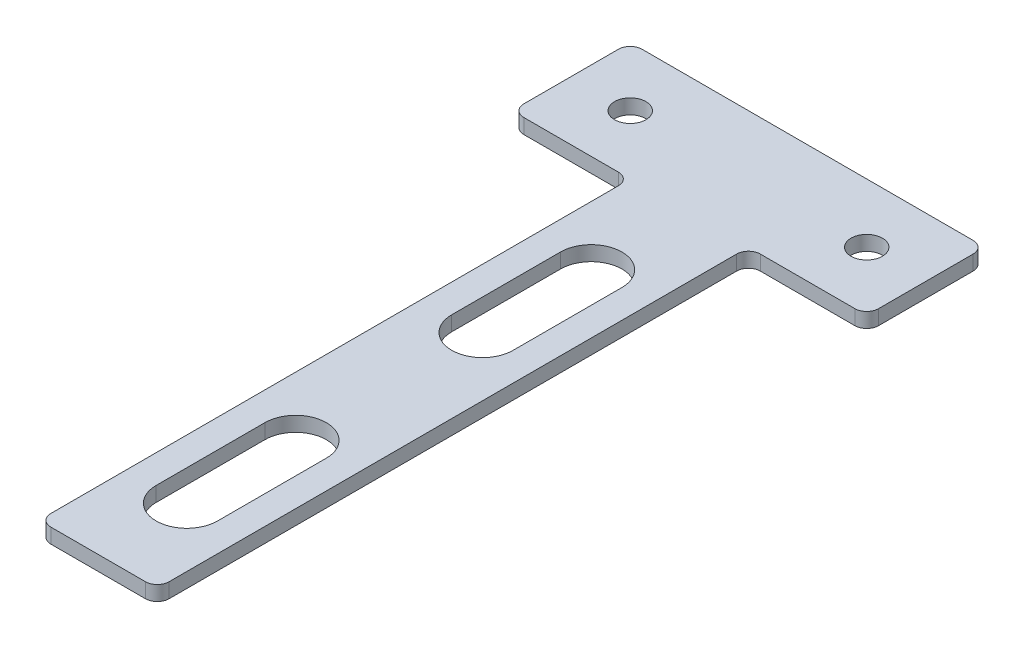
ISO-10303-21;
HEADER;
FILE_DESCRIPTION(('STEP AP214'),'2;1');
FILE_NAME('part.step','',(''),(''),'','','');
FILE_SCHEMA(('AUTOMOTIVE_DESIGN { 1 0 10303 214 1 1 1 1 }'));
ENDSEC;
DATA;
#1=APPLICATION_CONTEXT('core data for automotive mechanical design processes');
#2=APPLICATION_PROTOCOL_DEFINITION('international standard','automotive_design',2000,#1);
#3=PRODUCT_CONTEXT('',#1,'mechanical');
#4=PRODUCT('Part','Part','',(#3));
#5=PRODUCT_RELATED_PRODUCT_CATEGORY('part','',(#4));
#6=PRODUCT_DEFINITION_FORMATION('','',#4);
#7=PRODUCT_DEFINITION_CONTEXT('part definition',#1,'design');
#8=PRODUCT_DEFINITION('design','',#6,#7);
#9=PRODUCT_DEFINITION_SHAPE('','',#8);
#10=(LENGTH_UNIT() NAMED_UNIT(*) SI_UNIT(.MILLI.,.METRE.));
#11=(NAMED_UNIT(*) PLANE_ANGLE_UNIT() SI_UNIT($,.RADIAN.));
#12=(NAMED_UNIT(*) SI_UNIT($,.STERADIAN.) SOLID_ANGLE_UNIT());
#13=UNCERTAINTY_MEASURE_WITH_UNIT(LENGTH_MEASURE(1.E-05),#10,'distance_accuracy_value','');
#14=(GEOMETRIC_REPRESENTATION_CONTEXT(3) GLOBAL_UNCERTAINTY_ASSIGNED_CONTEXT((#13)) GLOBAL_UNIT_ASSIGNED_CONTEXT((#10,
#11,#12)) REPRESENTATION_CONTEXT('',''));
#15=CARTESIAN_POINT('',(0.,0.,0.));
#16=DIRECTION('',(0.,0.,1.));
#17=DIRECTION('',(1.,0.,0.));
#18=AXIS2_PLACEMENT_3D('',#15,#16,#17);
#19=CARTESIAN_POINT('',(0.,3.175,-76.2));
#20=DIRECTION('',(0.,0.,1.));
#21=DIRECTION('',(1.,0.,0.));
#22=AXIS2_PLACEMENT_3D('',#19,#20,#21);
#23=PLANE('',#22);
#24=DIRECTION('',(-1.,0.,0.));
#25=VECTOR('',#24,1.);
#26=CARTESIAN_POINT('',(0.,3.175,-76.2));
#27=LINE('',#26,#25);
#28=CARTESIAN_POINT('',(35.56,3.175,-76.2));
#29=VERTEX_POINT('',#28);
#30=CARTESIAN_POINT('',(-35.56,3.175,-76.2));
#31=VERTEX_POINT('',#30);
#32=EDGE_CURVE('E282',#29,#31,#27,.T.);
#33=ORIENTED_EDGE('',*,*,#32,.F.);
#34=DIRECTION('',(0.,-1.,0.));
#35=VECTOR('',#34,1.);
#36=CARTESIAN_POINT('',(35.56,0.,-76.2));
#37=LINE('',#36,#35);
#38=CARTESIAN_POINT('',(35.56,0.,-76.2));
#39=VERTEX_POINT('',#38);
#40=EDGE_CURVE('E386',#29,#39,#37,.T.);
#41=ORIENTED_EDGE('',*,*,#40,.T.);
#42=DIRECTION('',(-1.,0.,0.));
#43=VECTOR('',#42,1.);
#44=CARTESIAN_POINT('',(0.,0.,-76.2));
#45=LINE('',#44,#43);
#46=CARTESIAN_POINT('',(-35.56,0.,-76.2));
#47=VERTEX_POINT('',#46);
#48=EDGE_CURVE('E277',#39,#47,#45,.T.);
#49=ORIENTED_EDGE('',*,*,#48,.T.);
#50=DIRECTION('',(0.,-1.,0.));
#51=VECTOR('',#50,1.);
#52=CARTESIAN_POINT('',(-35.56,3.175,-76.2));
#53=LINE('',#52,#51);
#54=EDGE_CURVE('E384',#47,#31,#53,.F.);
#55=ORIENTED_EDGE('',*,*,#54,.T.);
#56=EDGE_LOOP('',(#33,#41,#49,#55));
#57=FACE_BOUND('',#56,.T.);
#58=ADVANCED_FACE('F34',(#57),#23,.F.);
#59=CARTESIAN_POINT('',(-38.1,3.175,0.));
#60=DIRECTION('',(1.,0.,0.));
#61=DIRECTION('',(0.,0.,-1.));
#62=AXIS2_PLACEMENT_3D('',#59,#60,#61);
#63=PLANE('',#62);
#64=DIRECTION('',(0.,0.,1.));
#65=VECTOR('',#64,1.);
#66=CARTESIAN_POINT('',(-38.1,0.,0.));
#67=LINE('',#66,#65);
#68=CARTESIAN_POINT('',(-38.1,0.,-73.66));
#69=VERTEX_POINT('',#68);
#70=CARTESIAN_POINT('',(-38.1,0.,-53.34));
#71=VERTEX_POINT('',#70);
#72=EDGE_CURVE('E308',#69,#71,#67,.T.);
#73=ORIENTED_EDGE('',*,*,#72,.T.);
#74=DIRECTION('',(0.,-1.,0.));
#75=VECTOR('',#74,1.);
#76=CARTESIAN_POINT('',(-38.1,3.175,-53.34));
#77=LINE('',#76,#75);
#78=CARTESIAN_POINT('',(-38.1,3.175,-53.34));
#79=VERTEX_POINT('',#78);
#80=EDGE_CURVE('E378',#71,#79,#77,.F.);
#81=ORIENTED_EDGE('',*,*,#80,.T.);
#82=DIRECTION('',(0.,0.,1.));
#83=VECTOR('',#82,1.);
#84=CARTESIAN_POINT('',(-38.1,3.175,0.));
#85=LINE('',#84,#83);
#86=CARTESIAN_POINT('',(-38.1,3.175,-73.66));
#87=VERTEX_POINT('',#86);
#88=EDGE_CURVE('E285',#87,#79,#85,.T.);
#89=ORIENTED_EDGE('',*,*,#88,.F.);
#90=DIRECTION('',(0.,-1.,0.));
#91=VECTOR('',#90,1.);
#92=CARTESIAN_POINT('',(-38.1,3.175,-73.66));
#93=LINE('',#92,#91);
#94=EDGE_CURVE('E375',#87,#69,#93,.T.);
#95=ORIENTED_EDGE('',*,*,#94,.T.);
#96=EDGE_LOOP('',(#73,#81,#89,#95));
#97=FACE_BOUND('',#96,.T.);
#98=ADVANCED_FACE('F454',(#97),#63,.F.);
#99=CARTESIAN_POINT('',(0.,3.175,-50.8));
#100=DIRECTION('',(0.,0.,1.));
#101=DIRECTION('',(1.,0.,0.));
#102=AXIS2_PLACEMENT_3D('',#99,#100,#101);
#103=PLANE('',#102);
#104=DIRECTION('',(-1.,0.,0.));
#105=VECTOR('',#104,1.);
#106=CARTESIAN_POINT('',(0.,0.,-50.8));
#107=LINE('',#106,#105);
#108=CARTESIAN_POINT('',(-15.24,0.,-50.8));
#109=VERTEX_POINT('',#108);
#110=CARTESIAN_POINT('',(-35.56,0.,-50.8));
#111=VERTEX_POINT('',#110);
#112=EDGE_CURVE('E311',#109,#111,#107,.T.);
#113=ORIENTED_EDGE('',*,*,#112,.F.);
#114=DIRECTION('',(0.,-1.,0.));
#115=VECTOR('',#114,1.);
#116=CARTESIAN_POINT('',(-15.24,3.175,-50.8));
#117=LINE('',#116,#115);
#118=CARTESIAN_POINT('',(-15.24,3.175,-50.8));
#119=VERTEX_POINT('',#118);
#120=EDGE_CURVE('E373',#109,#119,#117,.F.);
#121=ORIENTED_EDGE('',*,*,#120,.T.);
#122=DIRECTION('',(-1.,0.,0.));
#123=VECTOR('',#122,1.);
#124=CARTESIAN_POINT('',(0.,3.175,-50.8));
#125=LINE('',#124,#123);
#126=CARTESIAN_POINT('',(-35.56,3.175,-50.8));
#127=VERTEX_POINT('',#126);
#128=EDGE_CURVE('E289',#119,#127,#125,.T.);
#129=ORIENTED_EDGE('',*,*,#128,.T.);
#130=DIRECTION('',(0.,-1.,0.));
#131=VECTOR('',#130,1.);
#132=CARTESIAN_POINT('',(-35.56,0.,-50.8));
#133=LINE('',#132,#131);
#134=EDGE_CURVE('E370',#127,#111,#133,.T.);
#135=ORIENTED_EDGE('',*,*,#134,.T.);
#136=EDGE_LOOP('',(#113,#121,#129,#135));
#137=FACE_BOUND('',#136,.T.);
#138=ADVANCED_FACE('F400',(#137),#103,.T.);
#139=CARTESIAN_POINT('',(-12.7,3.175,0.));
#140=DIRECTION('',(1.,0.,0.));
#141=DIRECTION('',(0.,0.,-1.));
#142=AXIS2_PLACEMENT_3D('',#139,#140,#141);
#143=PLANE('',#142);
#144=DIRECTION('',(0.,0.,1.));
#145=VECTOR('',#144,1.);
#146=CARTESIAN_POINT('',(-12.7,0.,0.));
#147=LINE('',#146,#145);
#148=CARTESIAN_POINT('',(-12.7,0.,-48.26));
#149=VERTEX_POINT('',#148);
#150=CARTESIAN_POINT('',(-12.7000000000001,0.,73.66));
#151=VERTEX_POINT('',#150);
#152=EDGE_CURVE('E314',#149,#151,#147,.T.);
#153=ORIENTED_EDGE('',*,*,#152,.T.);
#154=DIRECTION('',(0.,-1.,0.));
#155=VECTOR('',#154,1.);
#156=CARTESIAN_POINT('',(-12.7000000000001,3.175,73.66));
#157=LINE('',#156,#155);
#158=CARTESIAN_POINT('',(-12.7000000000001,3.175,73.66));
#159=VERTEX_POINT('',#158);
#160=EDGE_CURVE('E347',#151,#159,#157,.F.);
#161=ORIENTED_EDGE('',*,*,#160,.T.);
#162=DIRECTION('',(0.,0.,1.));
#163=VECTOR('',#162,1.);
#164=CARTESIAN_POINT('',(-12.7,3.175,0.));
#165=LINE('',#164,#163);
#166=CARTESIAN_POINT('',(-12.7,3.175,-48.26));
#167=VERTEX_POINT('',#166);
#168=EDGE_CURVE('E292',#167,#159,#165,.T.);
#169=ORIENTED_EDGE('',*,*,#168,.F.);
#170=DIRECTION('',(0.,-1.,0.));
#171=VECTOR('',#170,1.);
#172=CARTESIAN_POINT('',(-12.7,3.175,-48.26));
#173=LINE('',#172,#171);
#174=EDGE_CURVE('E344',#167,#149,#173,.T.);
#175=ORIENTED_EDGE('',*,*,#174,.T.);
#176=EDGE_LOOP('',(#153,#161,#169,#175));
#177=FACE_BOUND('',#176,.T.);
#178=ADVANCED_FACE('F409',(#177),#143,.F.);
#179=CARTESIAN_POINT('',(0.,3.175,76.2));
#180=DIRECTION('',(0.,0.,-1.));
#181=DIRECTION('',(-1.,0.,0.));
#182=AXIS2_PLACEMENT_3D('',#179,#180,#181);
#183=PLANE('',#182);
#184=DIRECTION('',(1.,0.,0.));
#185=VECTOR('',#184,1.);
#186=CARTESIAN_POINT('',(0.,3.175,76.2));
#187=LINE('',#186,#185);
#188=CARTESIAN_POINT('',(-10.1600000000001,3.175,76.2));
#189=VERTEX_POINT('',#188);
#190=CARTESIAN_POINT('',(10.16,3.175,76.2));
#191=VERTEX_POINT('',#190);
#192=EDGE_CURVE('E295',#189,#191,#187,.T.);
#193=ORIENTED_EDGE('',*,*,#192,.F.);
#194=DIRECTION('',(0.,-1.,0.));
#195=VECTOR('',#194,1.);
#196=CARTESIAN_POINT('',(-10.1600000000001,3.175,76.2));
#197=LINE('',#196,#195);
#198=CARTESIAN_POINT('',(-10.1600000000001,0.,76.2));
#199=VERTEX_POINT('',#198);
#200=EDGE_CURVE('E329',#189,#199,#197,.T.);
#201=ORIENTED_EDGE('',*,*,#200,.T.);
#202=DIRECTION('',(1.,0.,0.));
#203=VECTOR('',#202,1.);
#204=CARTESIAN_POINT('',(0.,0.,76.2));
#205=LINE('',#204,#203);
#206=CARTESIAN_POINT('',(10.16,0.,76.2));
#207=VERTEX_POINT('',#206);
#208=EDGE_CURVE('E317',#199,#207,#205,.T.);
#209=ORIENTED_EDGE('',*,*,#208,.T.);
#210=DIRECTION('',(0.,-1.,0.));
#211=VECTOR('',#210,1.);
#212=CARTESIAN_POINT('',(10.16,3.175,76.2));
#213=LINE('',#212,#211);
#214=EDGE_CURVE('E305',#207,#191,#213,.F.);
#215=ORIENTED_EDGE('',*,*,#214,.T.);
#216=EDGE_LOOP('',(#193,#201,#209,#215));
#217=FACE_BOUND('',#216,.T.);
#218=ADVANCED_FACE('F417',(#217),#183,.F.);
#219=CARTESIAN_POINT('',(12.7,3.175,0.));
#220=DIRECTION('',(-1.,0.,0.));
#221=DIRECTION('',(0.,0.,1.));
#222=AXIS2_PLACEMENT_3D('',#219,#220,#221);
#223=PLANE('',#222);
#224=DIRECTION('',(0.,0.,-1.));
#225=VECTOR('',#224,1.);
#226=CARTESIAN_POINT('',(12.7,3.175,0.));
#227=LINE('',#226,#225);
#228=CARTESIAN_POINT('',(12.7,3.175,73.66));
#229=VERTEX_POINT('',#228);
#230=CARTESIAN_POINT('',(12.7,3.175,-48.26));
#231=VERTEX_POINT('',#230);
#232=EDGE_CURVE('E298',#229,#231,#227,.T.);
#233=ORIENTED_EDGE('',*,*,#232,.F.);
#234=DIRECTION('',(0.,-1.,0.));
#235=VECTOR('',#234,1.);
#236=CARTESIAN_POINT('',(12.7,3.175,73.66));
#237=LINE('',#236,#235);
#238=CARTESIAN_POINT('',(12.7,0.,73.66));
#239=VERTEX_POINT('',#238);
#240=EDGE_CURVE('E362',#229,#239,#237,.T.);
#241=ORIENTED_EDGE('',*,*,#240,.T.);
#242=DIRECTION('',(0.,0.,-1.));
#243=VECTOR('',#242,1.);
#244=CARTESIAN_POINT('',(12.7,0.,0.));
#245=LINE('',#244,#243);
#246=CARTESIAN_POINT('',(12.7,0.,-48.26));
#247=VERTEX_POINT('',#246);
#248=EDGE_CURVE('E320',#239,#247,#245,.T.);
#249=ORIENTED_EDGE('',*,*,#248,.T.);
#250=DIRECTION('',(0.,-1.,0.));
#251=VECTOR('',#250,1.);
#252=CARTESIAN_POINT('',(12.7,3.175,-48.26));
#253=LINE('',#252,#251);
#254=EDGE_CURVE('E360',#247,#231,#253,.F.);
#255=ORIENTED_EDGE('',*,*,#254,.T.);
#256=EDGE_LOOP('',(#233,#241,#249,#255));
#257=FACE_BOUND('',#256,.T.);
#258=ADVANCED_FACE('F425',(#257),#223,.F.);
#259=CARTESIAN_POINT('',(0.,3.175,-50.8));
#260=DIRECTION('',(0.,0.,-1.));
#261=DIRECTION('',(-1.,0.,0.));
#262=AXIS2_PLACEMENT_3D('',#259,#260,#261);
#263=PLANE('',#262);
#264=DIRECTION('',(1.,0.,0.));
#265=VECTOR('',#264,1.);
#266=CARTESIAN_POINT('',(0.,3.175,-50.8));
#267=LINE('',#266,#265);
#268=CARTESIAN_POINT('',(15.24,3.175,-50.8));
#269=VERTEX_POINT('',#268);
#270=CARTESIAN_POINT('',(35.56,3.175,-50.8));
#271=VERTEX_POINT('',#270);
#272=EDGE_CURVE('E301',#269,#271,#267,.T.);
#273=ORIENTED_EDGE('',*,*,#272,.F.);
#274=DIRECTION('',(0.,-1.,0.));
#275=VECTOR('',#274,1.);
#276=CARTESIAN_POINT('',(15.24,0.,-50.8));
#277=LINE('',#276,#275);
#278=CARTESIAN_POINT('',(15.24,0.,-50.8));
#279=VERTEX_POINT('',#278);
#280=EDGE_CURVE('E367',#269,#279,#277,.T.);
#281=ORIENTED_EDGE('',*,*,#280,.T.);
#282=DIRECTION('',(1.,0.,0.));
#283=VECTOR('',#282,1.);
#284=CARTESIAN_POINT('',(0.,0.,-50.8));
#285=LINE('',#284,#283);
#286=CARTESIAN_POINT('',(35.56,0.,-50.8));
#287=VERTEX_POINT('',#286);
#288=EDGE_CURVE('E323',#279,#287,#285,.T.);
#289=ORIENTED_EDGE('',*,*,#288,.T.);
#290=DIRECTION('',(0.,-1.,0.));
#291=VECTOR('',#290,1.);
#292=CARTESIAN_POINT('',(35.56,3.175,-50.8));
#293=LINE('',#292,#291);
#294=EDGE_CURVE('E365',#287,#271,#293,.F.);
#295=ORIENTED_EDGE('',*,*,#294,.T.);
#296=EDGE_LOOP('',(#273,#281,#289,#295));
#297=FACE_BOUND('',#296,.T.);
#298=ADVANCED_FACE('F433',(#297),#263,.F.);
#299=CARTESIAN_POINT('',(38.1,3.175,0.));
#300=DIRECTION('',(1.,0.,0.));
#301=DIRECTION('',(0.,0.,-1.));
#302=AXIS2_PLACEMENT_3D('',#299,#300,#301);
#303=PLANE('',#302);
#304=DIRECTION('',(0.,0.,1.));
#305=VECTOR('',#304,1.);
#306=CARTESIAN_POINT('',(38.1,3.175,0.));
#307=LINE('',#306,#305);
#308=CARTESIAN_POINT('',(38.1,3.175,-73.66));
#309=VERTEX_POINT('',#308);
#310=CARTESIAN_POINT('',(38.1,3.175,-53.34));
#311=VERTEX_POINT('',#310);
#312=EDGE_CURVE('E303',#309,#311,#307,.T.);
#313=ORIENTED_EDGE('',*,*,#312,.T.);
#314=DIRECTION('',(0.,-1.,0.));
#315=VECTOR('',#314,1.);
#316=CARTESIAN_POINT('',(38.1,0.,-53.34));
#317=LINE('',#316,#315);
#318=CARTESIAN_POINT('',(38.1,0.,-53.34));
#319=VERTEX_POINT('',#318);
#320=EDGE_CURVE('E381',#311,#319,#317,.T.);
#321=ORIENTED_EDGE('',*,*,#320,.T.);
#322=DIRECTION('',(0.,0.,1.));
#323=VECTOR('',#322,1.);
#324=CARTESIAN_POINT('',(38.1,0.,0.));
#325=LINE('',#324,#323);
#326=CARTESIAN_POINT('',(38.1,0.,-73.66));
#327=VERTEX_POINT('',#326);
#328=EDGE_CURVE('E286',#327,#319,#325,.T.);
#329=ORIENTED_EDGE('',*,*,#328,.F.);
#330=DIRECTION('',(0.,-1.,0.));
#331=VECTOR('',#330,1.);
#332=CARTESIAN_POINT('',(38.1,3.175,-73.66));
#333=LINE('',#332,#331);
#334=EDGE_CURVE('E56',#327,#309,#333,.F.);
#335=ORIENTED_EDGE('',*,*,#334,.T.);
#336=EDGE_LOOP('',(#313,#321,#329,#335));
#337=FACE_BOUND('',#336,.T.);
#338=ADVANCED_FACE('F439',(#337),#303,.T.);
#339=CARTESIAN_POINT('',(0.,3.175,0.));
#340=DIRECTION('',(0.,1.,0.));
#341=DIRECTION('',(0.,0.,1.));
#342=AXIS2_PLACEMENT_3D('',#339,#340,#341);
#343=PLANE('',#342);
#344=CARTESIAN_POINT('',(25.4,3.175,-63.5));
#345=DIRECTION('',(0.,1.,0.));
#346=DIRECTION('',(0.,0.,1.));
#347=AXIS2_PLACEMENT_3D('',#344,#345,#346);
#348=CIRCLE('',#347,3.3734375);
#349=CARTESIAN_POINT('',(25.4,3.175,-60.1265625));
#350=VERTEX_POINT('',#349);
#351=EDGE_CURVE('E227',#350,#350,#348,.T.);
#352=ORIENTED_EDGE('',*,*,#351,.F.);
#353=EDGE_LOOP('',(#352));
#354=FACE_BOUND('',#353,.T.);
#355=CARTESIAN_POINT('',(0.,3.175,-29.7180000000001));
#356=DIRECTION('',(0.,1.,0.));
#357=DIRECTION('',(0.,0.,1.));
#358=AXIS2_PLACEMENT_3D('',#355,#356,#357);
#359=CIRCLE('',#358,6.604);
#360=CARTESIAN_POINT('',(6.604,3.175,-29.7180000000001));
#361=VERTEX_POINT('',#360);
#362=CARTESIAN_POINT('',(-6.60399999999999,3.175,-29.7180000000001));
#363=VERTEX_POINT('',#362);
#364=EDGE_CURVE('E203',#361,#363,#359,.T.);
#365=ORIENTED_EDGE('',*,*,#364,.F.);
#366=DIRECTION('',(0.,0.,-1.));
#367=VECTOR('',#366,1.);
#368=CARTESIAN_POINT('',(6.604,3.175,-29.7180000000001));
#369=LINE('',#368,#367);
#370=CARTESIAN_POINT('',(6.60399999999998,3.175,-6.35000000000004));
#371=VERTEX_POINT('',#370);
#372=EDGE_CURVE('E221',#371,#361,#369,.T.);
#373=ORIENTED_EDGE('',*,*,#372,.F.);
#374=CARTESIAN_POINT('',(0.,3.175,-6.35000000000004));
#375=DIRECTION('',(0.,1.,0.));
#376=DIRECTION('',(0.,0.,1.));
#377=AXIS2_PLACEMENT_3D('',#374,#375,#376);
#378=CIRCLE('',#377,6.604);
#379=CARTESIAN_POINT('',(-6.60400000000002,3.175,-6.35000000000004));
#380=VERTEX_POINT('',#379);
#381=EDGE_CURVE('E224',#380,#371,#378,.T.);
#382=ORIENTED_EDGE('',*,*,#381,.F.);
#383=DIRECTION('',(0.,0.,1.));
#384=VECTOR('',#383,1.);
#385=CARTESIAN_POINT('',(-6.60399999999999,3.175,-29.7180000000001));
#386=LINE('',#385,#384);
#387=EDGE_CURVE('E233',#363,#380,#386,.T.);
#388=ORIENTED_EDGE('',*,*,#387,.F.);
#389=EDGE_LOOP('',(#365,#373,#382,#388));
#390=FACE_BOUND('',#389,.T.);
#391=CARTESIAN_POINT('',(0.,3.175,33.782));
#392=DIRECTION('',(0.,1.,0.));
#393=DIRECTION('',(0.,0.,1.));
#394=AXIS2_PLACEMENT_3D('',#391,#392,#393);
#395=CIRCLE('',#394,6.604);
#396=CARTESIAN_POINT('',(6.60400000000001,3.175,33.782));
#397=VERTEX_POINT('',#396);
#398=CARTESIAN_POINT('',(-6.60399999999999,3.175,33.782));
#399=VERTEX_POINT('',#398);
#400=EDGE_CURVE('E257',#397,#399,#395,.T.);
#401=ORIENTED_EDGE('',*,*,#400,.F.);
#402=DIRECTION('',(0.,0.,-1.));
#403=VECTOR('',#402,1.);
#404=CARTESIAN_POINT('',(6.60400000000001,3.175,33.782));
#405=LINE('',#404,#403);
#406=CARTESIAN_POINT('',(6.60399999999993,3.175,57.15));
#407=VERTEX_POINT('',#406);
#408=EDGE_CURVE('E247',#407,#397,#405,.T.);
#409=ORIENTED_EDGE('',*,*,#408,.F.);
#410=CARTESIAN_POINT('',(0.,3.175,57.15));
#411=DIRECTION('',(0.,1.,0.));
#412=DIRECTION('',(0.,0.,1.));
#413=AXIS2_PLACEMENT_3D('',#410,#411,#412);
#414=CIRCLE('',#413,6.604);
#415=CARTESIAN_POINT('',(-6.60400000000007,3.175,57.15));
#416=VERTEX_POINT('',#415);
#417=EDGE_CURVE('E262',#416,#407,#414,.T.);
#418=ORIENTED_EDGE('',*,*,#417,.F.);
#419=DIRECTION('',(0.,0.,1.));
#420=VECTOR('',#419,1.);
#421=CARTESIAN_POINT('',(-6.60399999999999,3.175,33.782));
#422=LINE('',#421,#420);
#423=EDGE_CURVE('E259',#399,#416,#422,.T.);
#424=ORIENTED_EDGE('',*,*,#423,.F.);
#425=EDGE_LOOP('',(#401,#409,#418,#424));
#426=FACE_BOUND('',#425,.T.);
#427=CARTESIAN_POINT('',(-25.4,3.175,-63.5));
#428=DIRECTION('',(0.,1.,0.));
#429=DIRECTION('',(0.,0.,1.));
#430=AXIS2_PLACEMENT_3D('',#427,#428,#429);
#431=CIRCLE('',#430,3.3734375);
#432=CARTESIAN_POINT('',(-25.4,3.175,-60.1265625));
#433=VERTEX_POINT('',#432);
#434=EDGE_CURVE('E278',#433,#433,#431,.T.);
#435=ORIENTED_EDGE('',*,*,#434,.F.);
#436=EDGE_LOOP('',(#435));
#437=FACE_BOUND('',#436,.T.);
#438=ORIENTED_EDGE('',*,*,#168,.T.);
#439=CARTESIAN_POINT('',(-10.1600000000001,3.175,73.66));
#440=DIRECTION('',(0.,1.,0.));
#441=DIRECTION('',(0.,0.,1.));
#442=AXIS2_PLACEMENT_3D('',#439,#440,#441);
#443=CIRCLE('',#442,2.54);
#444=EDGE_CURVE('E358',#159,#189,#443,.T.);
#445=ORIENTED_EDGE('',*,*,#444,.T.);
#446=ORIENTED_EDGE('',*,*,#192,.T.);
#447=CARTESIAN_POINT('',(10.16,3.175,73.66));
#448=DIRECTION('',(0.,1.,0.));
#449=DIRECTION('',(0.,0.,1.));
#450=AXIS2_PLACEMENT_3D('',#447,#448,#449);
#451=CIRCLE('',#450,2.54);
#452=EDGE_CURVE('E356',#191,#229,#451,.T.);
#453=ORIENTED_EDGE('',*,*,#452,.T.);
#454=ORIENTED_EDGE('',*,*,#232,.T.);
#455=CARTESIAN_POINT('',(15.24,3.175,-48.26));
#456=DIRECTION('',(0.,1.,0.));
#457=DIRECTION('',(0.,0.,1.));
#458=AXIS2_PLACEMENT_3D('',#455,#456,#457);
#459=CIRCLE('',#458,2.54);
#460=EDGE_CURVE('E391',#231,#269,#459,.F.);
#461=ORIENTED_EDGE('',*,*,#460,.T.);
#462=ORIENTED_EDGE('',*,*,#272,.T.);
#463=CARTESIAN_POINT('',(35.56,3.175,-53.34));
#464=DIRECTION('',(0.,1.,0.));
#465=DIRECTION('',(0.,0.,1.));
#466=AXIS2_PLACEMENT_3D('',#463,#464,#465);
#467=CIRCLE('',#466,2.54);
#468=EDGE_CURVE('E49',#271,#311,#467,.T.);
#469=ORIENTED_EDGE('',*,*,#468,.T.);
#470=ORIENTED_EDGE('',*,*,#312,.F.);
#471=CARTESIAN_POINT('',(35.56,3.175,-73.66));
#472=DIRECTION('',(0.,1.,0.));
#473=DIRECTION('',(0.,0.,1.));
#474=AXIS2_PLACEMENT_3D('',#471,#472,#473);
#475=CIRCLE('',#474,2.54);
#476=EDGE_CURVE('E351',#309,#29,#475,.T.);
#477=ORIENTED_EDGE('',*,*,#476,.T.);
#478=ORIENTED_EDGE('',*,*,#32,.T.);
#479=CARTESIAN_POINT('',(-35.56,3.175,-73.66));
#480=DIRECTION('',(0.,1.,0.));
#481=DIRECTION('',(0.,0.,1.));
#482=AXIS2_PLACEMENT_3D('',#479,#480,#481);
#483=CIRCLE('',#482,2.54);
#484=EDGE_CURVE('E349',#31,#87,#483,.T.);
#485=ORIENTED_EDGE('',*,*,#484,.T.);
#486=ORIENTED_EDGE('',*,*,#88,.T.);
#487=CARTESIAN_POINT('',(-35.56,3.175,-53.34));
#488=DIRECTION('',(0.,1.,0.));
#489=DIRECTION('',(0.,0.,1.));
#490=AXIS2_PLACEMENT_3D('',#487,#488,#489);
#491=CIRCLE('',#490,2.54);
#492=EDGE_CURVE('E354',#79,#127,#491,.T.);
#493=ORIENTED_EDGE('',*,*,#492,.T.);
#494=ORIENTED_EDGE('',*,*,#128,.F.);
#495=CARTESIAN_POINT('',(-15.24,3.175,-48.26));
#496=DIRECTION('',(0.,1.,0.));
#497=DIRECTION('',(0.,0.,1.));
#498=AXIS2_PLACEMENT_3D('',#495,#496,#497);
#499=CIRCLE('',#498,2.54);
#500=EDGE_CURVE('E11',#119,#167,#499,.F.);
#501=ORIENTED_EDGE('',*,*,#500,.T.);
#502=EDGE_LOOP('',(#438,#445,#446,#453,#454,#461,#462,#469,#470,#477,#478,#485,#486,#493,#494,#501));
#503=FACE_BOUND('',#502,.T.);
#504=ADVANCED_FACE('F406',(#354,#390,#426,#437,#503),#343,.T.);
#505=CARTESIAN_POINT('',(0.,0.,0.));
#506=DIRECTION('',(0.,1.,0.));
#507=DIRECTION('',(0.,0.,1.));
#508=AXIS2_PLACEMENT_3D('',#505,#506,#507);
#509=PLANE('',#508);
#510=CARTESIAN_POINT('',(25.4,0.,-63.5));
#511=DIRECTION('',(0.,1.,0.));
#512=DIRECTION('',(0.,0.,1.));
#513=AXIS2_PLACEMENT_3D('',#510,#511,#512);
#514=CIRCLE('',#513,3.3734375);
#515=CARTESIAN_POINT('',(25.4,0.,-60.1265625));
#516=VERTEX_POINT('',#515);
#517=EDGE_CURVE('E281',#516,#516,#514,.T.);
#518=ORIENTED_EDGE('',*,*,#517,.T.);
#519=EDGE_LOOP('',(#518));
#520=FACE_BOUND('',#519,.T.);
#521=DIRECTION('',(0.,0.,-1.));
#522=VECTOR('',#521,1.);
#523=CARTESIAN_POINT('',(6.604,0.,-29.7180000000001));
#524=LINE('',#523,#522);
#525=CARTESIAN_POINT('',(6.60399999999998,0.,-6.35000000000004));
#526=VERTEX_POINT('',#525);
#527=CARTESIAN_POINT('',(6.604,0.,-29.7180000000001));
#528=VERTEX_POINT('',#527);
#529=EDGE_CURVE('E208',#526,#528,#524,.T.);
#530=ORIENTED_EDGE('',*,*,#529,.T.);
#531=CARTESIAN_POINT('',(0.,0.,-29.7180000000001));
#532=DIRECTION('',(0.,1.,0.));
#533=DIRECTION('',(0.,0.,1.));
#534=AXIS2_PLACEMENT_3D('',#531,#532,#533);
#535=CIRCLE('',#534,6.604);
#536=CARTESIAN_POINT('',(-6.60399999999999,0.,-29.7180000000001));
#537=VERTEX_POINT('',#536);
#538=EDGE_CURVE('E200',#528,#537,#535,.T.);
#539=ORIENTED_EDGE('',*,*,#538,.T.);
#540=DIRECTION('',(0.,0.,1.));
#541=VECTOR('',#540,1.);
#542=CARTESIAN_POINT('',(-6.60399999999999,0.,-29.7180000000001));
#543=LINE('',#542,#541);
#544=CARTESIAN_POINT('',(-6.60400000000002,0.,-6.35000000000004));
#545=VERTEX_POINT('',#544);
#546=EDGE_CURVE('E212',#537,#545,#543,.T.);
#547=ORIENTED_EDGE('',*,*,#546,.T.);
#548=CARTESIAN_POINT('',(0.,0.,-6.35000000000004));
#549=DIRECTION('',(0.,1.,0.));
#550=DIRECTION('',(0.,0.,1.));
#551=AXIS2_PLACEMENT_3D('',#548,#549,#550);
#552=CIRCLE('',#551,6.604);
#553=EDGE_CURVE('E216',#545,#526,#552,.T.);
#554=ORIENTED_EDGE('',*,*,#553,.T.);
#555=EDGE_LOOP('',(#530,#539,#547,#554));
#556=FACE_BOUND('',#555,.T.);
#557=DIRECTION('',(0.,0.,-1.));
#558=VECTOR('',#557,1.);
#559=CARTESIAN_POINT('',(6.60400000000001,0.,33.782));
#560=LINE('',#559,#558);
#561=CARTESIAN_POINT('',(6.60399999999993,0.,57.15));
#562=VERTEX_POINT('',#561);
#563=CARTESIAN_POINT('',(6.60400000000001,0.,33.782));
#564=VERTEX_POINT('',#563);
#565=EDGE_CURVE('E253',#562,#564,#560,.T.);
#566=ORIENTED_EDGE('',*,*,#565,.T.);
#567=CARTESIAN_POINT('',(0.,0.,33.782));
#568=DIRECTION('',(0.,1.,0.));
#569=DIRECTION('',(0.,0.,1.));
#570=AXIS2_PLACEMENT_3D('',#567,#568,#569);
#571=CIRCLE('',#570,6.604);
#572=CARTESIAN_POINT('',(-6.60399999999999,0.,33.782));
#573=VERTEX_POINT('',#572);
#574=EDGE_CURVE('E243',#564,#573,#571,.T.);
#575=ORIENTED_EDGE('',*,*,#574,.T.);
#576=DIRECTION('',(0.,0.,1.));
#577=VECTOR('',#576,1.);
#578=CARTESIAN_POINT('',(-6.60399999999999,0.,33.782));
#579=LINE('',#578,#577);
#580=CARTESIAN_POINT('',(-6.60400000000007,0.,57.15));
#581=VERTEX_POINT('',#580);
#582=EDGE_CURVE('E246',#573,#581,#579,.T.);
#583=ORIENTED_EDGE('',*,*,#582,.T.);
#584=CARTESIAN_POINT('',(0.,0.,57.15));
#585=DIRECTION('',(0.,1.,0.));
#586=DIRECTION('',(0.,0.,1.));
#587=AXIS2_PLACEMENT_3D('',#584,#585,#586);
#588=CIRCLE('',#587,6.604);
#589=EDGE_CURVE('E250',#581,#562,#588,.T.);
#590=ORIENTED_EDGE('',*,*,#589,.T.);
#591=EDGE_LOOP('',(#566,#575,#583,#590));
#592=FACE_BOUND('',#591,.T.);
#593=CARTESIAN_POINT('',(-25.4,0.,-63.5));
#594=DIRECTION('',(0.,1.,0.));
#595=DIRECTION('',(0.,0.,1.));
#596=AXIS2_PLACEMENT_3D('',#593,#594,#595);
#597=CIRCLE('',#596,3.3734375);
#598=CARTESIAN_POINT('',(-25.4,0.,-60.1265625));
#599=VERTEX_POINT('',#598);
#600=EDGE_CURVE('E274',#599,#599,#597,.T.);
#601=ORIENTED_EDGE('',*,*,#600,.T.);
#602=EDGE_LOOP('',(#601));
#603=FACE_BOUND('',#602,.T.);
#604=ORIENTED_EDGE('',*,*,#208,.F.);
#605=CARTESIAN_POINT('',(-10.1600000000001,0.,73.66));
#606=DIRECTION('',(0.,1.,0.));
#607=DIRECTION('',(0.,0.,1.));
#608=AXIS2_PLACEMENT_3D('',#605,#606,#607);
#609=CIRCLE('',#608,2.54);
#610=EDGE_CURVE('E342',#199,#151,#609,.F.);
#611=ORIENTED_EDGE('',*,*,#610,.T.);
#612=ORIENTED_EDGE('',*,*,#152,.F.);
#613=CARTESIAN_POINT('',(-15.24,0.,-48.26));
#614=DIRECTION('',(0.,1.,0.));
#615=DIRECTION('',(0.,0.,1.));
#616=AXIS2_PLACEMENT_3D('',#613,#614,#615);
#617=CIRCLE('',#616,2.54);
#618=EDGE_CURVE('E42',#149,#109,#617,.T.);
#619=ORIENTED_EDGE('',*,*,#618,.T.);
#620=ORIENTED_EDGE('',*,*,#112,.T.);
#621=CARTESIAN_POINT('',(-35.56,0.,-53.34));
#622=DIRECTION('',(0.,1.,0.));
#623=DIRECTION('',(0.,0.,1.));
#624=AXIS2_PLACEMENT_3D('',#621,#622,#623);
#625=CIRCLE('',#624,2.54);
#626=EDGE_CURVE('E338',#111,#71,#625,.F.);
#627=ORIENTED_EDGE('',*,*,#626,.T.);
#628=ORIENTED_EDGE('',*,*,#72,.F.);
#629=CARTESIAN_POINT('',(-35.56,0.,-73.66));
#630=DIRECTION('',(0.,1.,0.));
#631=DIRECTION('',(0.,0.,1.));
#632=AXIS2_PLACEMENT_3D('',#629,#630,#631);
#633=CIRCLE('',#632,2.54);
#634=EDGE_CURVE('E332',#69,#47,#633,.F.);
#635=ORIENTED_EDGE('',*,*,#634,.T.);
#636=ORIENTED_EDGE('',*,*,#48,.F.);
#637=CARTESIAN_POINT('',(35.56,0.,-73.66));
#638=DIRECTION('',(0.,1.,0.));
#639=DIRECTION('',(0.,0.,1.));
#640=AXIS2_PLACEMENT_3D('',#637,#638,#639);
#641=CIRCLE('',#640,2.54);
#642=EDGE_CURVE('E334',#39,#327,#641,.F.);
#643=ORIENTED_EDGE('',*,*,#642,.T.);
#644=ORIENTED_EDGE('',*,*,#328,.T.);
#645=CARTESIAN_POINT('',(35.56,0.,-53.34));
#646=DIRECTION('',(0.,1.,0.));
#647=DIRECTION('',(0.,0.,1.));
#648=AXIS2_PLACEMENT_3D('',#645,#646,#647);
#649=CIRCLE('',#648,2.54);
#650=EDGE_CURVE('E336',#319,#287,#649,.F.);
#651=ORIENTED_EDGE('',*,*,#650,.T.);
#652=ORIENTED_EDGE('',*,*,#288,.F.);
#653=CARTESIAN_POINT('',(15.24,0.,-48.26));
#654=DIRECTION('',(0.,1.,0.));
#655=DIRECTION('',(0.,0.,1.));
#656=AXIS2_PLACEMENT_3D('',#653,#654,#655);
#657=CIRCLE('',#656,2.54);
#658=EDGE_CURVE('E389',#279,#247,#657,.T.);
#659=ORIENTED_EDGE('',*,*,#658,.T.);
#660=ORIENTED_EDGE('',*,*,#248,.F.);
#661=CARTESIAN_POINT('',(10.16,0.,73.66));
#662=DIRECTION('',(0.,1.,0.));
#663=DIRECTION('',(0.,0.,1.));
#664=AXIS2_PLACEMENT_3D('',#661,#662,#663);
#665=CIRCLE('',#664,2.54);
#666=EDGE_CURVE('E340',#239,#207,#665,.F.);
#667=ORIENTED_EDGE('',*,*,#666,.T.);
#668=EDGE_LOOP('',(#604,#611,#612,#619,#620,#627,#628,#635,#636,#643,#644,#651,#652,#659,#660,#667));
#669=FACE_BOUND('',#668,.T.);
#670=ADVANCED_FACE('F218',(#520,#556,#592,#603,#669),#509,.F.);
#671=CARTESIAN_POINT('',(-25.4,0.,-63.5));
#672=DIRECTION('',(0.,1.,0.));
#673=DIRECTION('',(0.,0.,1.));
#674=AXIS2_PLACEMENT_3D('',#671,#672,#673);
#675=CYLINDRICAL_SURFACE('',#674,3.3734375);
#676=ORIENTED_EDGE('',*,*,#600,.F.);
#677=EDGE_LOOP('',(#676));
#678=FACE_BOUND('',#677,.T.);
#679=ORIENTED_EDGE('',*,*,#434,.T.);
#680=EDGE_LOOP('',(#679));
#681=FACE_BOUND('',#680,.T.);
#682=ADVANCED_FACE('F603',(#678,#681),#675,.F.);
#683=CARTESIAN_POINT('',(0.,0.,33.782));
#684=DIRECTION('',(0.,1.,0.));
#685=DIRECTION('',(0.,0.,1.));
#686=AXIS2_PLACEMENT_3D('',#683,#684,#685);
#687=CYLINDRICAL_SURFACE('',#686,6.604);
#688=ORIENTED_EDGE('',*,*,#400,.T.);
#689=DIRECTION('',(0.,1.,0.));
#690=VECTOR('',#689,1.);
#691=CARTESIAN_POINT('',(-6.60399999999999,0.,33.782));
#692=LINE('',#691,#690);
#693=EDGE_CURVE('E256',#573,#399,#692,.T.);
#694=ORIENTED_EDGE('',*,*,#693,.F.);
#695=ORIENTED_EDGE('',*,*,#574,.F.);
#696=DIRECTION('',(0.,1.,0.));
#697=VECTOR('',#696,1.);
#698=CARTESIAN_POINT('',(6.60400000000001,0.,33.782));
#699=LINE('',#698,#697);
#700=EDGE_CURVE('E234',#564,#397,#699,.T.);
#701=ORIENTED_EDGE('',*,*,#700,.T.);
#702=EDGE_LOOP('',(#688,#694,#695,#701));
#703=FACE_BOUND('',#702,.T.);
#704=ADVANCED_FACE('F594',(#703),#687,.F.);
#705=CARTESIAN_POINT('',(6.60400000000001,0.,33.782));
#706=DIRECTION('',(1.,0.,0.));
#707=DIRECTION('',(0.,0.,-1.));
#708=AXIS2_PLACEMENT_3D('',#705,#706,#707);
#709=PLANE('',#708);
#710=ORIENTED_EDGE('',*,*,#408,.T.);
#711=ORIENTED_EDGE('',*,*,#700,.F.);
#712=ORIENTED_EDGE('',*,*,#565,.F.);
#713=DIRECTION('',(0.,1.,0.));
#714=VECTOR('',#713,1.);
#715=CARTESIAN_POINT('',(6.60399999999993,0.,57.15));
#716=LINE('',#715,#714);
#717=EDGE_CURVE('E268',#562,#407,#716,.T.);
#718=ORIENTED_EDGE('',*,*,#717,.T.);
#719=EDGE_LOOP('',(#710,#711,#712,#718));
#720=FACE_BOUND('',#719,.T.);
#721=ADVANCED_FACE('F585',(#720),#709,.F.);
#722=CARTESIAN_POINT('',(0.,0.,57.15));
#723=DIRECTION('',(0.,1.,0.));
#724=DIRECTION('',(0.,0.,1.));
#725=AXIS2_PLACEMENT_3D('',#722,#723,#724);
#726=CYLINDRICAL_SURFACE('',#725,6.604);
#727=ORIENTED_EDGE('',*,*,#417,.T.);
#728=ORIENTED_EDGE('',*,*,#717,.F.);
#729=ORIENTED_EDGE('',*,*,#589,.F.);
#730=DIRECTION('',(0.,1.,0.));
#731=VECTOR('',#730,1.);
#732=CARTESIAN_POINT('',(-6.60400000000007,0.,57.15));
#733=LINE('',#732,#731);
#734=EDGE_CURVE('E270',#581,#416,#733,.T.);
#735=ORIENTED_EDGE('',*,*,#734,.T.);
#736=EDGE_LOOP('',(#727,#728,#729,#735));
#737=FACE_BOUND('',#736,.T.);
#738=ADVANCED_FACE('F576',(#737),#726,.F.);
#739=CARTESIAN_POINT('',(-6.60399999999999,0.,33.782));
#740=DIRECTION('',(-1.,0.,0.));
#741=DIRECTION('',(0.,0.,1.));
#742=AXIS2_PLACEMENT_3D('',#739,#740,#741);
#743=PLANE('',#742);
#744=ORIENTED_EDGE('',*,*,#423,.T.);
#745=ORIENTED_EDGE('',*,*,#734,.F.);
#746=ORIENTED_EDGE('',*,*,#582,.F.);
#747=ORIENTED_EDGE('',*,*,#693,.T.);
#748=EDGE_LOOP('',(#744,#745,#746,#747));
#749=FACE_BOUND('',#748,.T.);
#750=ADVANCED_FACE('F568',(#749),#743,.F.);
#751=CARTESIAN_POINT('',(0.,0.,-29.7180000000001));
#752=DIRECTION('',(0.,1.,0.));
#753=DIRECTION('',(0.,0.,1.));
#754=AXIS2_PLACEMENT_3D('',#751,#752,#753);
#755=CYLINDRICAL_SURFACE('',#754,6.604);
#756=ORIENTED_EDGE('',*,*,#364,.T.);
#757=DIRECTION('',(0.,1.,0.));
#758=VECTOR('',#757,1.);
#759=CARTESIAN_POINT('',(-6.60399999999999,0.,-29.7180000000001));
#760=LINE('',#759,#758);
#761=EDGE_CURVE('E196',#537,#363,#760,.T.);
#762=ORIENTED_EDGE('',*,*,#761,.F.);
#763=ORIENTED_EDGE('',*,*,#538,.F.);
#764=DIRECTION('',(0.,1.,0.));
#765=VECTOR('',#764,1.);
#766=CARTESIAN_POINT('',(6.604,0.,-29.7180000000001));
#767=LINE('',#766,#765);
#768=EDGE_CURVE('E238',#528,#361,#767,.T.);
#769=ORIENTED_EDGE('',*,*,#768,.T.);
#770=EDGE_LOOP('',(#756,#762,#763,#769));
#771=FACE_BOUND('',#770,.T.);
#772=ADVANCED_FACE('F198',(#771),#755,.F.);
#773=CARTESIAN_POINT('',(6.604,0.,-29.7180000000001));
#774=DIRECTION('',(1.,0.,0.));
#775=DIRECTION('',(0.,0.,-1.));
#776=AXIS2_PLACEMENT_3D('',#773,#774,#775);
#777=PLANE('',#776);
#778=ORIENTED_EDGE('',*,*,#372,.T.);
#779=ORIENTED_EDGE('',*,*,#768,.F.);
#780=ORIENTED_EDGE('',*,*,#529,.F.);
#781=DIRECTION('',(0.,1.,0.));
#782=VECTOR('',#781,1.);
#783=CARTESIAN_POINT('',(6.60399999999998,0.,-6.35000000000004));
#784=LINE('',#783,#782);
#785=EDGE_CURVE('E240',#526,#371,#784,.T.);
#786=ORIENTED_EDGE('',*,*,#785,.T.);
#787=EDGE_LOOP('',(#778,#779,#780,#786));
#788=FACE_BOUND('',#787,.T.);
#789=ADVANCED_FACE('F551',(#788),#777,.F.);
#790=CARTESIAN_POINT('',(0.,0.,-6.35000000000004));
#791=DIRECTION('',(0.,1.,0.));
#792=DIRECTION('',(0.,0.,1.));
#793=AXIS2_PLACEMENT_3D('',#790,#791,#792);
#794=CYLINDRICAL_SURFACE('',#793,6.604);
#795=ORIENTED_EDGE('',*,*,#381,.T.);
#796=ORIENTED_EDGE('',*,*,#785,.F.);
#797=ORIENTED_EDGE('',*,*,#553,.F.);
#798=DIRECTION('',(0.,1.,0.));
#799=VECTOR('',#798,1.);
#800=CARTESIAN_POINT('',(-6.60400000000002,0.,-6.35000000000004));
#801=LINE('',#800,#799);
#802=EDGE_CURVE('E207',#545,#380,#801,.T.);
#803=ORIENTED_EDGE('',*,*,#802,.T.);
#804=EDGE_LOOP('',(#795,#796,#797,#803));
#805=FACE_BOUND('',#804,.T.);
#806=ADVANCED_FACE('F543',(#805),#794,.F.);
#807=CARTESIAN_POINT('',(-6.60399999999999,0.,-29.7180000000001));
#808=DIRECTION('',(-1.,0.,0.));
#809=DIRECTION('',(0.,0.,1.));
#810=AXIS2_PLACEMENT_3D('',#807,#808,#809);
#811=PLANE('',#810);
#812=ORIENTED_EDGE('',*,*,#387,.T.);
#813=ORIENTED_EDGE('',*,*,#802,.F.);
#814=ORIENTED_EDGE('',*,*,#546,.F.);
#815=ORIENTED_EDGE('',*,*,#761,.T.);
#816=EDGE_LOOP('',(#812,#813,#814,#815));
#817=FACE_BOUND('',#816,.T.);
#818=ADVANCED_FACE('F213',(#817),#811,.F.);
#819=CARTESIAN_POINT('',(25.4,0.,-63.5));
#820=DIRECTION('',(0.,1.,0.));
#821=DIRECTION('',(0.,0.,1.));
#822=AXIS2_PLACEMENT_3D('',#819,#820,#821);
#823=CYLINDRICAL_SURFACE('',#822,3.3734375);
#824=ORIENTED_EDGE('',*,*,#517,.F.);
#825=EDGE_LOOP('',(#824));
#826=FACE_BOUND('',#825,.T.);
#827=ORIENTED_EDGE('',*,*,#351,.T.);
#828=EDGE_LOOP('',(#827));
#829=FACE_BOUND('',#828,.T.);
#830=ADVANCED_FACE('F477',(#826,#829),#823,.F.);
#831=CARTESIAN_POINT('',(-10.1600000000001,3.175,73.66));
#832=DIRECTION('',(0.,-1.,0.));
#833=DIRECTION('',(0.,0.,-1.));
#834=AXIS2_PLACEMENT_3D('',#831,#832,#833);
#835=CYLINDRICAL_SURFACE('',#834,2.54);
#836=ORIENTED_EDGE('',*,*,#444,.F.);
#837=ORIENTED_EDGE('',*,*,#160,.F.);
#838=ORIENTED_EDGE('',*,*,#610,.F.);
#839=ORIENTED_EDGE('',*,*,#200,.F.);
#840=EDGE_LOOP('',(#836,#837,#838,#839));
#841=FACE_BOUND('',#840,.T.);
#842=ADVANCED_FACE('F412',(#841),#835,.T.);
#843=CARTESIAN_POINT('',(10.16,3.175,73.66));
#844=DIRECTION('',(0.,-1.,0.));
#845=DIRECTION('',(0.,0.,-1.));
#846=AXIS2_PLACEMENT_3D('',#843,#844,#845);
#847=CYLINDRICAL_SURFACE('',#846,2.54);
#848=ORIENTED_EDGE('',*,*,#452,.F.);
#849=ORIENTED_EDGE('',*,*,#214,.F.);
#850=ORIENTED_EDGE('',*,*,#666,.F.);
#851=ORIENTED_EDGE('',*,*,#240,.F.);
#852=EDGE_LOOP('',(#848,#849,#850,#851));
#853=FACE_BOUND('',#852,.T.);
#854=ADVANCED_FACE('F420',(#853),#847,.T.);
#855=CARTESIAN_POINT('',(15.24,3.175,-48.26));
#856=DIRECTION('',(0.,1.,0.));
#857=DIRECTION('',(0.,0.,1.));
#858=AXIS2_PLACEMENT_3D('',#855,#856,#857);
#859=CYLINDRICAL_SURFACE('',#858,2.54);
#860=ORIENTED_EDGE('',*,*,#460,.F.);
#861=ORIENTED_EDGE('',*,*,#254,.F.);
#862=ORIENTED_EDGE('',*,*,#658,.F.);
#863=ORIENTED_EDGE('',*,*,#280,.F.);
#864=EDGE_LOOP('',(#860,#861,#862,#863));
#865=FACE_BOUND('',#864,.T.);
#866=ADVANCED_FACE('F429',(#865),#859,.F.);
#867=CARTESIAN_POINT('',(-15.24,3.175,-48.26));
#868=DIRECTION('',(0.,-1.,0.));
#869=DIRECTION('',(0.,0.,-1.));
#870=AXIS2_PLACEMENT_3D('',#867,#868,#869);
#871=CYLINDRICAL_SURFACE('',#870,2.54);
#872=ORIENTED_EDGE('',*,*,#500,.F.);
#873=ORIENTED_EDGE('',*,*,#120,.F.);
#874=ORIENTED_EDGE('',*,*,#618,.F.);
#875=ORIENTED_EDGE('',*,*,#174,.F.);
#876=EDGE_LOOP('',(#872,#873,#874,#875));
#877=FACE_BOUND('',#876,.T.);
#878=ADVANCED_FACE('F404',(#877),#871,.F.);
#879=CARTESIAN_POINT('',(-35.56,3.175,-53.34));
#880=DIRECTION('',(0.,1.,0.));
#881=DIRECTION('',(0.,0.,1.));
#882=AXIS2_PLACEMENT_3D('',#879,#880,#881);
#883=CYLINDRICAL_SURFACE('',#882,2.54);
#884=ORIENTED_EDGE('',*,*,#492,.F.);
#885=ORIENTED_EDGE('',*,*,#80,.F.);
#886=ORIENTED_EDGE('',*,*,#626,.F.);
#887=ORIENTED_EDGE('',*,*,#134,.F.);
#888=EDGE_LOOP('',(#884,#885,#886,#887));
#889=FACE_BOUND('',#888,.T.);
#890=ADVANCED_FACE('F458',(#889),#883,.T.);
#891=CARTESIAN_POINT('',(35.56,3.175,-53.34));
#892=DIRECTION('',(0.,1.,0.));
#893=DIRECTION('',(0.,0.,1.));
#894=AXIS2_PLACEMENT_3D('',#891,#892,#893);
#895=CYLINDRICAL_SURFACE('',#894,2.54);
#896=ORIENTED_EDGE('',*,*,#468,.F.);
#897=ORIENTED_EDGE('',*,*,#294,.F.);
#898=ORIENTED_EDGE('',*,*,#650,.F.);
#899=ORIENTED_EDGE('',*,*,#320,.F.);
#900=EDGE_LOOP('',(#896,#897,#898,#899));
#901=FACE_BOUND('',#900,.T.);
#902=ADVANCED_FACE('F437',(#901),#895,.T.);
#903=CARTESIAN_POINT('',(35.56,3.175,-73.66));
#904=DIRECTION('',(0.,1.,0.));
#905=DIRECTION('',(0.,0.,1.));
#906=AXIS2_PLACEMENT_3D('',#903,#904,#905);
#907=CYLINDRICAL_SURFACE('',#906,2.54);
#908=ORIENTED_EDGE('',*,*,#476,.F.);
#909=ORIENTED_EDGE('',*,*,#334,.F.);
#910=ORIENTED_EDGE('',*,*,#642,.F.);
#911=ORIENTED_EDGE('',*,*,#40,.F.);
#912=EDGE_LOOP('',(#908,#909,#910,#911));
#913=FACE_BOUND('',#912,.T.);
#914=ADVANCED_FACE('F444',(#913),#907,.T.);
#915=CARTESIAN_POINT('',(-35.56,3.175,-73.66));
#916=DIRECTION('',(0.,-1.,0.));
#917=DIRECTION('',(0.,0.,-1.));
#918=AXIS2_PLACEMENT_3D('',#915,#916,#917);
#919=CYLINDRICAL_SURFACE('',#918,2.54);
#920=ORIENTED_EDGE('',*,*,#484,.F.);
#921=ORIENTED_EDGE('',*,*,#54,.F.);
#922=ORIENTED_EDGE('',*,*,#634,.F.);
#923=ORIENTED_EDGE('',*,*,#94,.F.);
#924=EDGE_LOOP('',(#920,#921,#922,#923));
#925=FACE_BOUND('',#924,.T.);
#926=ADVANCED_FACE('F36',(#925),#919,.T.);
#927=CLOSED_SHELL('',(#58,#98,#138,#178,#218,#258,#298,#338,#504,#670,#682,#704,#721,#738,#750,
#772,#789,#806,#818,#830,#842,#854,#866,#878,#890,#902,#914,#926));
#928=MANIFOLD_SOLID_BREP('B2',#927);
#929=ADVANCED_BREP_SHAPE_REPRESENTATION('',(#18,#928),#14);
#930=SHAPE_DEFINITION_REPRESENTATION(#9,#929);
ENDSEC;
END-ISO-10303-21;
